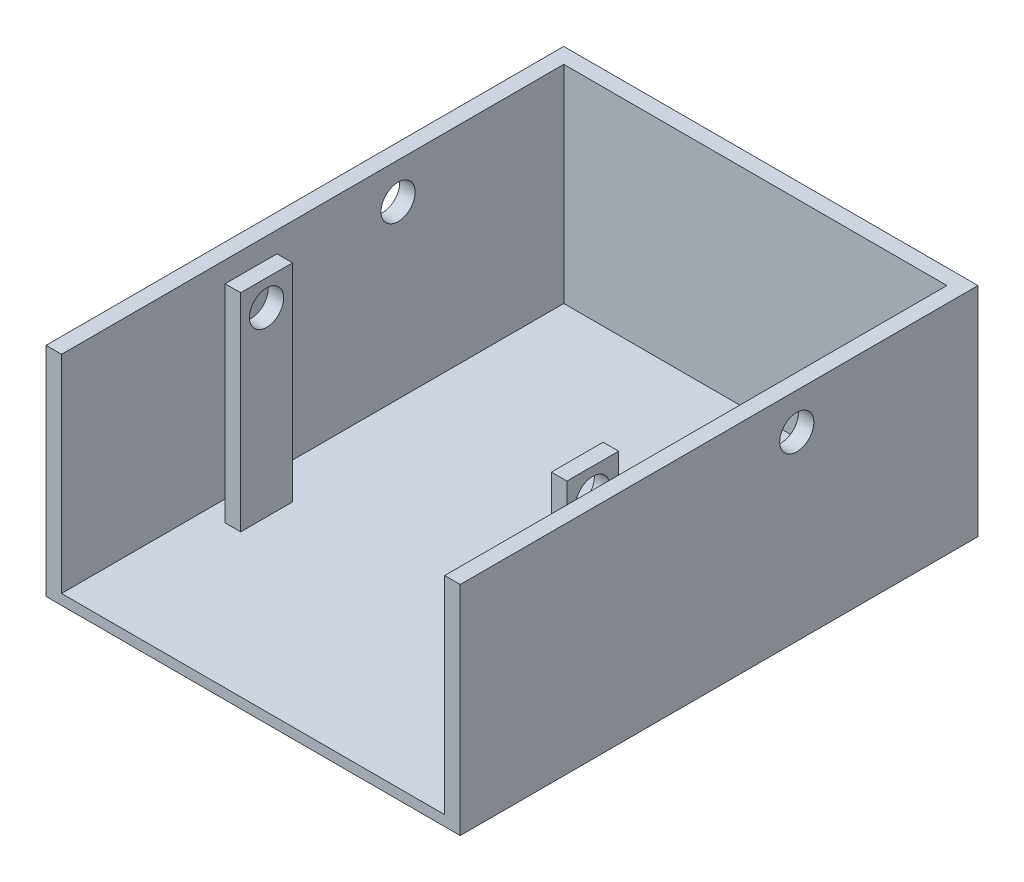
ISO-10303-21;
HEADER;
FILE_DESCRIPTION(('STEP AP214'),'2;1');
FILE_NAME('part.step','',(''),(''),'','','');
FILE_SCHEMA(('AUTOMOTIVE_DESIGN { 1 0 10303 214 1 1 1 1 }'));
ENDSEC;
DATA;
#1=APPLICATION_CONTEXT('core data for automotive mechanical design processes');
#2=APPLICATION_PROTOCOL_DEFINITION('international standard','automotive_design',2000,#1);
#3=PRODUCT_CONTEXT('',#1,'mechanical');
#4=PRODUCT('Part','Part','',(#3));
#5=PRODUCT_RELATED_PRODUCT_CATEGORY('part','',(#4));
#6=PRODUCT_DEFINITION_FORMATION('','',#4);
#7=PRODUCT_DEFINITION_CONTEXT('part definition',#1,'design');
#8=PRODUCT_DEFINITION('design','',#6,#7);
#9=PRODUCT_DEFINITION_SHAPE('','',#8);
#10=(LENGTH_UNIT() NAMED_UNIT(*) SI_UNIT(.MILLI.,.METRE.));
#11=(NAMED_UNIT(*) PLANE_ANGLE_UNIT() SI_UNIT($,.RADIAN.));
#12=(NAMED_UNIT(*) SI_UNIT($,.STERADIAN.) SOLID_ANGLE_UNIT());
#13=UNCERTAINTY_MEASURE_WITH_UNIT(LENGTH_MEASURE(1.E-05),#10,'distance_accuracy_value','');
#14=(GEOMETRIC_REPRESENTATION_CONTEXT(3) GLOBAL_UNCERTAINTY_ASSIGNED_CONTEXT((#13)) GLOBAL_UNIT_ASSIGNED_CONTEXT((#10,
#11,#12)) REPRESENTATION_CONTEXT('',''));
#15=CARTESIAN_POINT('',(0.,0.,0.));
#16=DIRECTION('',(0.,0.,1.));
#17=DIRECTION('',(1.,0.,0.));
#18=AXIS2_PLACEMENT_3D('',#15,#16,#17);
#19=CARTESIAN_POINT('',(0.,10.,0.));
#20=DIRECTION('',(0.,1.,0.));
#21=DIRECTION('',(0.,0.,1.));
#22=AXIS2_PLACEMENT_3D('',#19,#20,#21);
#23=PLANE('',#22);
#24=DIRECTION('',(0.,0.,1.));
#25=VECTOR('',#24,1.);
#26=CARTESIAN_POINT('',(185.,10.,0.));
#27=LINE('',#26,#25);
#28=CARTESIAN_POINT('',(185.,10.,-235.));
#29=VERTEX_POINT('',#28);
#30=CARTESIAN_POINT('',(185.,10.,250.));
#31=VERTEX_POINT('',#30);
#32=EDGE_CURVE('E225',#29,#31,#27,.T.);
#33=ORIENTED_EDGE('',*,*,#32,.F.);
#34=DIRECTION('',(1.,0.,0.));
#35=VECTOR('',#34,1.);
#36=CARTESIAN_POINT('',(0.,10.,-235.));
#37=LINE('',#36,#35);
#38=CARTESIAN_POINT('',(-185.,10.,-235.));
#39=VERTEX_POINT('',#38);
#40=EDGE_CURVE('E230',#39,#29,#37,.T.);
#41=ORIENTED_EDGE('',*,*,#40,.F.);
#42=DIRECTION('',(0.,0.,1.));
#43=VECTOR('',#42,1.);
#44=CARTESIAN_POINT('',(-185.,10.,0.));
#45=LINE('',#44,#43);
#46=CARTESIAN_POINT('',(-185.,10.,250.));
#47=VERTEX_POINT('',#46);
#48=EDGE_CURVE('E251',#39,#47,#45,.T.);
#49=ORIENTED_EDGE('',*,*,#48,.T.);
#50=DIRECTION('',(1.,0.,0.));
#51=VECTOR('',#50,1.);
#52=CARTESIAN_POINT('',(-200.,10.,250.));
#53=LINE('',#52,#51);
#54=EDGE_CURVE('E264',#47,#31,#53,.T.);
#55=ORIENTED_EDGE('',*,*,#54,.T.);
#56=EDGE_LOOP('',(#33,#41,#49,#55));
#57=FACE_BOUND('',#56,.T.);
#58=DIRECTION('',(-1.,0.,0.));
#59=VECTOR('',#58,1.);
#60=CARTESIAN_POINT('',(-165.,10.,62.0000000000001));
#61=LINE('',#60,#59);
#62=CARTESIAN_POINT('',(-150.,10.,61.9999999999999));
#63=VERTEX_POINT('',#62);
#64=CARTESIAN_POINT('',(-165.,10.,62.0000000000001));
#65=VERTEX_POINT('',#64);
#66=EDGE_CURVE('E182',#63,#65,#61,.T.);
#67=ORIENTED_EDGE('',*,*,#66,.F.);
#68=DIRECTION('',(0.,0.,-1.));
#69=VECTOR('',#68,1.);
#70=CARTESIAN_POINT('',(-150.,10.,61.9999999999999));
#71=LINE('',#70,#69);
#72=CARTESIAN_POINT('',(-150.,10.,112.));
#73=VERTEX_POINT('',#72);
#74=EDGE_CURVE('E179',#73,#63,#71,.T.);
#75=ORIENTED_EDGE('',*,*,#74,.F.);
#76=DIRECTION('',(1.,0.,0.));
#77=VECTOR('',#76,1.);
#78=CARTESIAN_POINT('',(-165.,10.,112.));
#79=LINE('',#78,#77);
#80=CARTESIAN_POINT('',(-165.,10.,112.));
#81=VERTEX_POINT('',#80);
#82=EDGE_CURVE('E197',#81,#73,#79,.T.);
#83=ORIENTED_EDGE('',*,*,#82,.F.);
#84=DIRECTION('',(0.,0.,1.));
#85=VECTOR('',#84,1.);
#86=CARTESIAN_POINT('',(-165.,10.,62.0000000000001));
#87=LINE('',#86,#85);
#88=EDGE_CURVE('E205',#65,#81,#87,.T.);
#89=ORIENTED_EDGE('',*,*,#88,.F.);
#90=EDGE_LOOP('',(#67,#75,#83,#89));
#91=FACE_BOUND('',#90,.T.);
#92=DIRECTION('',(-1.,0.,0.));
#93=VECTOR('',#92,1.);
#94=CARTESIAN_POINT('',(150.,10.,61.9999999999999));
#95=LINE('',#94,#93);
#96=CARTESIAN_POINT('',(165.,10.,61.9999999999999));
#97=VERTEX_POINT('',#96);
#98=CARTESIAN_POINT('',(150.,10.,61.9999999999999));
#99=VERTEX_POINT('',#98);
#100=EDGE_CURVE('E178',#97,#99,#95,.T.);
#101=ORIENTED_EDGE('',*,*,#100,.F.);
#102=DIRECTION('',(0.,0.,-1.));
#103=VECTOR('',#102,1.);
#104=CARTESIAN_POINT('',(165.,10.,61.9999999999999));
#105=LINE('',#104,#103);
#106=CARTESIAN_POINT('',(165.,10.,112.));
#107=VERTEX_POINT('',#106);
#108=EDGE_CURVE('E173',#107,#97,#105,.T.);
#109=ORIENTED_EDGE('',*,*,#108,.F.);
#110=DIRECTION('',(1.,0.,0.));
#111=VECTOR('',#110,1.);
#112=CARTESIAN_POINT('',(150.,10.,112.));
#113=LINE('',#112,#111);
#114=CARTESIAN_POINT('',(150.,10.,112.));
#115=VERTEX_POINT('',#114);
#116=EDGE_CURVE('E158',#115,#107,#113,.T.);
#117=ORIENTED_EDGE('',*,*,#116,.F.);
#118=DIRECTION('',(0.,0.,1.));
#119=VECTOR('',#118,1.);
#120=CARTESIAN_POINT('',(150.,10.,61.9999999999999));
#121=LINE('',#120,#119);
#122=EDGE_CURVE('E166',#99,#115,#121,.T.);
#123=ORIENTED_EDGE('',*,*,#122,.F.);
#124=EDGE_LOOP('',(#101,#109,#117,#123));
#125=FACE_BOUND('',#124,.T.);
#126=ADVANCED_FACE('F43',(#57,#91,#125),#23,.T.);
#127=CARTESIAN_POINT('',(200.,10.,-250.));
#128=DIRECTION('',(-1.,0.,0.));
#129=DIRECTION('',(0.,0.,1.));
#130=AXIS2_PLACEMENT_3D('',#127,#128,#129);
#131=PLANE('',#130);
#132=CARTESIAN_POINT('',(200.,175.,-75.));
#133=DIRECTION('',(-1.,0.,0.));
#134=DIRECTION('',(0.,0.,1.));
#135=AXIS2_PLACEMENT_3D('',#132,#133,#134);
#136=CIRCLE('',#135,16.5);
#137=CARTESIAN_POINT('',(200.,175.,-58.5));
#138=VERTEX_POINT('',#137);
#139=EDGE_CURVE('E216',#138,#138,#136,.T.);
#140=ORIENTED_EDGE('',*,*,#139,.T.);
#141=EDGE_LOOP('',(#140));
#142=FACE_BOUND('',#141,.T.);
#143=DIRECTION('',(0.,0.,-1.));
#144=VECTOR('',#143,1.);
#145=CARTESIAN_POINT('',(200.,0.,-250.));
#146=LINE('',#145,#144);
#147=CARTESIAN_POINT('',(200.,0.,250.));
#148=VERTEX_POINT('',#147);
#149=CARTESIAN_POINT('',(200.,0.,-250.));
#150=VERTEX_POINT('',#149);
#151=EDGE_CURVE('E263',#148,#150,#146,.T.);
#152=ORIENTED_EDGE('',*,*,#151,.T.);
#153=DIRECTION('',(0.,-1.,0.));
#154=VECTOR('',#153,1.);
#155=CARTESIAN_POINT('',(200.,10.,-250.));
#156=LINE('',#155,#154);
#157=CARTESIAN_POINT('',(200.,210.,-250.));
#158=VERTEX_POINT('',#157);
#159=EDGE_CURVE('E11',#158,#150,#156,.T.);
#160=ORIENTED_EDGE('',*,*,#159,.F.);
#161=DIRECTION('',(0.,0.,-1.));
#162=VECTOR('',#161,1.);
#163=CARTESIAN_POINT('',(200.,210.,0.));
#164=LINE('',#163,#162);
#165=CARTESIAN_POINT('',(200.,210.,250.));
#166=VERTEX_POINT('',#165);
#167=EDGE_CURVE('E233',#166,#158,#164,.T.);
#168=ORIENTED_EDGE('',*,*,#167,.F.);
#169=DIRECTION('',(0.,-1.,0.));
#170=VECTOR('',#169,1.);
#171=CARTESIAN_POINT('',(200.,10.,250.));
#172=LINE('',#171,#170);
#173=EDGE_CURVE('E267',#166,#148,#172,.T.);
#174=ORIENTED_EDGE('',*,*,#173,.T.);
#175=EDGE_LOOP('',(#152,#160,#168,#174));
#176=FACE_BOUND('',#175,.T.);
#177=ADVANCED_FACE('F45',(#142,#176),#131,.F.);
#178=CARTESIAN_POINT('',(-200.,10.,-250.));
#179=DIRECTION('',(0.,0.,1.));
#180=DIRECTION('',(1.,0.,0.));
#181=AXIS2_PLACEMENT_3D('',#178,#179,#180);
#182=PLANE('',#181);
#183=DIRECTION('',(-1.,0.,0.));
#184=VECTOR('',#183,1.);
#185=CARTESIAN_POINT('',(-200.,0.,-250.));
#186=LINE('',#185,#184);
#187=CARTESIAN_POINT('',(-200.,0.,-250.));
#188=VERTEX_POINT('',#187);
#189=EDGE_CURVE('E271',#150,#188,#186,.T.);
#190=ORIENTED_EDGE('',*,*,#189,.T.);
#191=DIRECTION('',(0.,-1.,0.));
#192=VECTOR('',#191,1.);
#193=CARTESIAN_POINT('',(-200.,10.,-250.));
#194=LINE('',#193,#192);
#195=CARTESIAN_POINT('',(-200.,210.,-250.));
#196=VERTEX_POINT('',#195);
#197=EDGE_CURVE('E52',#196,#188,#194,.T.);
#198=ORIENTED_EDGE('',*,*,#197,.F.);
#199=DIRECTION('',(-1.,0.,0.));
#200=VECTOR('',#199,1.);
#201=CARTESIAN_POINT('',(0.,210.,-250.));
#202=LINE('',#201,#200);
#203=EDGE_CURVE('E237',#158,#196,#202,.T.);
#204=ORIENTED_EDGE('',*,*,#203,.F.);
#205=ORIENTED_EDGE('',*,*,#159,.T.);
#206=EDGE_LOOP('',(#190,#198,#204,#205));
#207=FACE_BOUND('',#206,.T.);
#208=ADVANCED_FACE('F299',(#207),#182,.F.);
#209=CARTESIAN_POINT('',(-200.,10.,-250.));
#210=DIRECTION('',(1.,0.,0.));
#211=DIRECTION('',(0.,0.,-1.));
#212=AXIS2_PLACEMENT_3D('',#209,#210,#211);
#213=PLANE('',#212);
#214=CARTESIAN_POINT('',(-200.,175.,-75.));
#215=DIRECTION('',(1.,0.,0.));
#216=DIRECTION('',(0.,0.,-1.));
#217=AXIS2_PLACEMENT_3D('',#214,#215,#216);
#218=CIRCLE('',#217,16.5);
#219=CARTESIAN_POINT('',(-200.,175.,-91.5));
#220=VERTEX_POINT('',#219);
#221=EDGE_CURVE('E222',#220,#220,#218,.T.);
#222=ORIENTED_EDGE('',*,*,#221,.T.);
#223=EDGE_LOOP('',(#222));
#224=FACE_BOUND('',#223,.T.);
#225=DIRECTION('',(0.,0.,1.));
#226=VECTOR('',#225,1.);
#227=CARTESIAN_POINT('',(-200.,0.,-250.));
#228=LINE('',#227,#226);
#229=CARTESIAN_POINT('',(-200.,0.,250.));
#230=VERTEX_POINT('',#229);
#231=EDGE_CURVE('E273',#188,#230,#228,.T.);
#232=ORIENTED_EDGE('',*,*,#231,.T.);
#233=DIRECTION('',(0.,-1.,0.));
#234=VECTOR('',#233,1.);
#235=CARTESIAN_POINT('',(-200.,10.,250.));
#236=LINE('',#235,#234);
#237=CARTESIAN_POINT('',(-200.,210.,250.));
#238=VERTEX_POINT('',#237);
#239=EDGE_CURVE('E278',#238,#230,#236,.T.);
#240=ORIENTED_EDGE('',*,*,#239,.F.);
#241=DIRECTION('',(0.,0.,1.));
#242=VECTOR('',#241,1.);
#243=CARTESIAN_POINT('',(-200.,210.,0.));
#244=LINE('',#243,#242);
#245=EDGE_CURVE('E240',#196,#238,#244,.T.);
#246=ORIENTED_EDGE('',*,*,#245,.F.);
#247=ORIENTED_EDGE('',*,*,#197,.T.);
#248=EDGE_LOOP('',(#232,#240,#246,#247));
#249=FACE_BOUND('',#248,.T.);
#250=ADVANCED_FACE('F285',(#224,#249),#213,.F.);
#251=CARTESIAN_POINT('',(-200.,10.,250.));
#252=DIRECTION('',(0.,0.,-1.));
#253=DIRECTION('',(-1.,0.,0.));
#254=AXIS2_PLACEMENT_3D('',#251,#252,#253);
#255=PLANE('',#254);
#256=DIRECTION('',(1.,0.,0.));
#257=VECTOR('',#256,1.);
#258=CARTESIAN_POINT('',(-200.,0.,250.));
#259=LINE('',#258,#257);
#260=EDGE_CURVE('E268',#230,#148,#259,.T.);
#261=ORIENTED_EDGE('',*,*,#260,.T.);
#262=ORIENTED_EDGE('',*,*,#173,.F.);
#263=DIRECTION('',(1.,0.,0.));
#264=VECTOR('',#263,1.);
#265=CARTESIAN_POINT('',(0.,210.,250.));
#266=LINE('',#265,#264);
#267=CARTESIAN_POINT('',(185.,210.,250.));
#268=VERTEX_POINT('',#267);
#269=EDGE_CURVE('E229',#268,#166,#266,.T.);
#270=ORIENTED_EDGE('',*,*,#269,.F.);
#271=DIRECTION('',(0.,-1.,0.));
#272=VECTOR('',#271,1.);
#273=CARTESIAN_POINT('',(185.,210.,250.));
#274=LINE('',#273,#272);
#275=EDGE_CURVE('E261',#268,#31,#274,.T.);
#276=ORIENTED_EDGE('',*,*,#275,.T.);
#277=ORIENTED_EDGE('',*,*,#54,.F.);
#278=DIRECTION('',(0.,-1.,0.));
#279=VECTOR('',#278,1.);
#280=CARTESIAN_POINT('',(-185.,210.,250.));
#281=LINE('',#280,#279);
#282=CARTESIAN_POINT('',(-185.,210.,250.));
#283=VERTEX_POINT('',#282);
#284=EDGE_CURVE('E259',#283,#47,#281,.T.);
#285=ORIENTED_EDGE('',*,*,#284,.F.);
#286=EDGE_CURVE('E234',#238,#283,#266,.T.);
#287=ORIENTED_EDGE('',*,*,#286,.F.);
#288=ORIENTED_EDGE('',*,*,#239,.T.);
#289=EDGE_LOOP('',(#261,#262,#270,#276,#277,#285,#287,#288));
#290=FACE_BOUND('',#289,.T.);
#291=ADVANCED_FACE('F293',(#290),#255,.F.);
#292=CARTESIAN_POINT('',(0.,0.,0.));
#293=DIRECTION('',(0.,1.,0.));
#294=DIRECTION('',(0.,0.,1.));
#295=AXIS2_PLACEMENT_3D('',#292,#293,#294);
#296=PLANE('',#295);
#297=ORIENTED_EDGE('',*,*,#151,.F.);
#298=ORIENTED_EDGE('',*,*,#260,.F.);
#299=ORIENTED_EDGE('',*,*,#231,.F.);
#300=ORIENTED_EDGE('',*,*,#189,.F.);
#301=EDGE_LOOP('',(#297,#298,#299,#300));
#302=FACE_BOUND('',#301,.T.);
#303=ADVANCED_FACE('F291',(#302),#296,.F.);
#304=CARTESIAN_POINT('',(185.,210.,0.));
#305=DIRECTION('',(1.,0.,0.));
#306=DIRECTION('',(0.,0.,-1.));
#307=AXIS2_PLACEMENT_3D('',#304,#305,#306);
#308=PLANE('',#307);
#309=CARTESIAN_POINT('',(185.,175.,-75.));
#310=DIRECTION('',(1.,0.,0.));
#311=DIRECTION('',(0.,0.,-1.));
#312=AXIS2_PLACEMENT_3D('',#309,#310,#311);
#313=CIRCLE('',#312,16.5);
#314=CARTESIAN_POINT('',(185.,175.,-91.5));
#315=VERTEX_POINT('',#314);
#316=EDGE_CURVE('E219',#315,#315,#313,.T.);
#317=ORIENTED_EDGE('',*,*,#316,.T.);
#318=EDGE_LOOP('',(#317));
#319=FACE_BOUND('',#318,.T.);
#320=ORIENTED_EDGE('',*,*,#32,.T.);
#321=ORIENTED_EDGE('',*,*,#275,.F.);
#322=DIRECTION('',(0.,0.,1.));
#323=VECTOR('',#322,1.);
#324=CARTESIAN_POINT('',(185.,210.,0.));
#325=LINE('',#324,#323);
#326=CARTESIAN_POINT('',(185.,210.,-235.));
#327=VERTEX_POINT('',#326);
#328=EDGE_CURVE('E226',#327,#268,#325,.T.);
#329=ORIENTED_EDGE('',*,*,#328,.F.);
#330=DIRECTION('',(0.,-1.,0.));
#331=VECTOR('',#330,1.);
#332=CARTESIAN_POINT('',(185.,210.,-235.));
#333=LINE('',#332,#331);
#334=EDGE_CURVE('E248',#327,#29,#333,.T.);
#335=ORIENTED_EDGE('',*,*,#334,.T.);
#336=EDGE_LOOP('',(#320,#321,#329,#335));
#337=FACE_BOUND('',#336,.T.);
#338=ADVANCED_FACE('F317',(#319,#337),#308,.F.);
#339=CARTESIAN_POINT('',(-185.,210.,0.));
#340=DIRECTION('',(1.,0.,0.));
#341=DIRECTION('',(0.,0.,-1.));
#342=AXIS2_PLACEMENT_3D('',#339,#340,#341);
#343=PLANE('',#342);
#344=CARTESIAN_POINT('',(-185.,175.,-75.));
#345=DIRECTION('',(1.,0.,0.));
#346=DIRECTION('',(0.,0.,-1.));
#347=AXIS2_PLACEMENT_3D('',#344,#345,#346);
#348=CIRCLE('',#347,16.5);
#349=CARTESIAN_POINT('',(-185.,175.,-91.5));
#350=VERTEX_POINT('',#349);
#351=EDGE_CURVE('E47',#350,#350,#348,.T.);
#352=ORIENTED_EDGE('',*,*,#351,.F.);
#353=EDGE_LOOP('',(#352));
#354=FACE_BOUND('',#353,.T.);
#355=ORIENTED_EDGE('',*,*,#48,.F.);
#356=DIRECTION('',(0.,-1.,0.));
#357=VECTOR('',#356,1.);
#358=CARTESIAN_POINT('',(-185.,210.,-235.));
#359=LINE('',#358,#357);
#360=CARTESIAN_POINT('',(-185.,210.,-235.));
#361=VERTEX_POINT('',#360);
#362=EDGE_CURVE('E257',#361,#39,#359,.T.);
#363=ORIENTED_EDGE('',*,*,#362,.F.);
#364=DIRECTION('',(0.,0.,1.));
#365=VECTOR('',#364,1.);
#366=CARTESIAN_POINT('',(-185.,210.,0.));
#367=LINE('',#366,#365);
#368=EDGE_CURVE('E243',#361,#283,#367,.T.);
#369=ORIENTED_EDGE('',*,*,#368,.T.);
#370=ORIENTED_EDGE('',*,*,#284,.T.);
#371=EDGE_LOOP('',(#355,#363,#369,#370));
#372=FACE_BOUND('',#371,.T.);
#373=ADVANCED_FACE('F336',(#354,#372),#343,.T.);
#374=CARTESIAN_POINT('',(0.,210.,-235.));
#375=DIRECTION('',(0.,0.,-1.));
#376=DIRECTION('',(-1.,0.,0.));
#377=AXIS2_PLACEMENT_3D('',#374,#375,#376);
#378=PLANE('',#377);
#379=ORIENTED_EDGE('',*,*,#40,.T.);
#380=ORIENTED_EDGE('',*,*,#334,.F.);
#381=DIRECTION('',(1.,0.,0.));
#382=VECTOR('',#381,1.);
#383=CARTESIAN_POINT('',(0.,210.,-235.));
#384=LINE('',#383,#382);
#385=EDGE_CURVE('E246',#361,#327,#384,.T.);
#386=ORIENTED_EDGE('',*,*,#385,.F.);
#387=ORIENTED_EDGE('',*,*,#362,.T.);
#388=EDGE_LOOP('',(#379,#380,#386,#387));
#389=FACE_BOUND('',#388,.T.);
#390=ADVANCED_FACE('F343',(#389),#378,.F.);
#391=CARTESIAN_POINT('',(0.,210.,0.));
#392=DIRECTION('',(0.,1.,0.));
#393=DIRECTION('',(0.,0.,1.));
#394=AXIS2_PLACEMENT_3D('',#391,#392,#393);
#395=PLANE('',#394);
#396=ORIENTED_EDGE('',*,*,#328,.T.);
#397=ORIENTED_EDGE('',*,*,#269,.T.);
#398=ORIENTED_EDGE('',*,*,#167,.T.);
#399=ORIENTED_EDGE('',*,*,#203,.T.);
#400=ORIENTED_EDGE('',*,*,#245,.T.);
#401=ORIENTED_EDGE('',*,*,#286,.T.);
#402=ORIENTED_EDGE('',*,*,#368,.F.);
#403=ORIENTED_EDGE('',*,*,#385,.T.);
#404=EDGE_LOOP('',(#396,#397,#398,#399,#400,#401,#402,#403));
#405=FACE_BOUND('',#404,.T.);
#406=ADVANCED_FACE('F298',(#405),#395,.T.);
#407=CARTESIAN_POINT('',(200.,175.,-75.));
#408=DIRECTION('',(-1.,0.,0.));
#409=DIRECTION('',(0.,0.,1.));
#410=AXIS2_PLACEMENT_3D('',#407,#408,#409);
#411=CYLINDRICAL_SURFACE('',#410,16.5);
#412=ORIENTED_EDGE('',*,*,#351,.T.);
#413=EDGE_LOOP('',(#412));
#414=FACE_BOUND('',#413,.T.);
#415=ORIENTED_EDGE('',*,*,#221,.F.);
#416=EDGE_LOOP('',(#415));
#417=FACE_BOUND('',#416,.T.);
#418=ADVANCED_FACE('F357',(#414,#417),#411,.F.);
#419=ORIENTED_EDGE('',*,*,#139,.F.);
#420=EDGE_LOOP('',(#419));
#421=FACE_BOUND('',#420,.T.);
#422=ORIENTED_EDGE('',*,*,#316,.F.);
#423=EDGE_LOOP('',(#422));
#424=FACE_BOUND('',#423,.T.);
#425=ADVANCED_FACE('F364',(#421,#424),#411,.F.);
#426=CARTESIAN_POINT('',(-150.,210.,61.9999999999999));
#427=DIRECTION('',(-1.,0.,0.));
#428=DIRECTION('',(0.,0.,1.));
#429=AXIS2_PLACEMENT_3D('',#426,#427,#428);
#430=PLANE('',#429);
#431=CARTESIAN_POINT('',(-150.,185.,87.));
#432=DIRECTION('',(1.,0.,0.));
#433=DIRECTION('',(0.,0.,-1.));
#434=AXIS2_PLACEMENT_3D('',#431,#432,#433);
#435=CIRCLE('',#434,16.5);
#436=CARTESIAN_POINT('',(-150.,185.,70.5));
#437=VERTEX_POINT('',#436);
#438=EDGE_CURVE('E670',#437,#437,#435,.T.);
#439=ORIENTED_EDGE('',*,*,#438,.F.);
#440=EDGE_LOOP('',(#439));
#441=FACE_BOUND('',#440,.T.);
#442=ORIENTED_EDGE('',*,*,#74,.T.);
#443=DIRECTION('',(0.,-1.,0.));
#444=VECTOR('',#443,1.);
#445=CARTESIAN_POINT('',(-150.,210.,61.9999999999999));
#446=LINE('',#445,#444);
#447=CARTESIAN_POINT('',(-150.,210.,61.9999999999999));
#448=VERTEX_POINT('',#447);
#449=EDGE_CURVE('E214',#448,#63,#446,.T.);
#450=ORIENTED_EDGE('',*,*,#449,.F.);
#451=DIRECTION('',(0.,0.,-1.));
#452=VECTOR('',#451,1.);
#453=CARTESIAN_POINT('',(-150.,210.,61.9999999999999));
#454=LINE('',#453,#452);
#455=CARTESIAN_POINT('',(-150.,210.,112.));
#456=VERTEX_POINT('',#455);
#457=EDGE_CURVE('E193',#456,#448,#454,.T.);
#458=ORIENTED_EDGE('',*,*,#457,.F.);
#459=DIRECTION('',(0.,-1.,0.));
#460=VECTOR('',#459,1.);
#461=CARTESIAN_POINT('',(-150.,210.,112.));
#462=LINE('',#461,#460);
#463=EDGE_CURVE('E202',#456,#73,#462,.T.);
#464=ORIENTED_EDGE('',*,*,#463,.T.);
#465=EDGE_LOOP('',(#442,#450,#458,#464));
#466=FACE_BOUND('',#465,.T.);
#467=ADVANCED_FACE('F372',(#441,#466),#430,.F.);
#468=CARTESIAN_POINT('',(-165.,210.,62.0000000000001));
#469=DIRECTION('',(0.,0.,1.));
#470=DIRECTION('',(1.,0.,0.));
#471=AXIS2_PLACEMENT_3D('',#468,#469,#470);
#472=PLANE('',#471);
#473=ORIENTED_EDGE('',*,*,#66,.T.);
#474=DIRECTION('',(0.,-1.,0.));
#475=VECTOR('',#474,1.);
#476=CARTESIAN_POINT('',(-165.,210.,62.0000000000001));
#477=LINE('',#476,#475);
#478=CARTESIAN_POINT('',(-165.,210.,62.0000000000001));
#479=VERTEX_POINT('',#478);
#480=EDGE_CURVE('E211',#479,#65,#477,.T.);
#481=ORIENTED_EDGE('',*,*,#480,.F.);
#482=DIRECTION('',(-1.,0.,0.));
#483=VECTOR('',#482,1.);
#484=CARTESIAN_POINT('',(-165.,210.,62.0000000000001));
#485=LINE('',#484,#483);
#486=EDGE_CURVE('E196',#448,#479,#485,.T.);
#487=ORIENTED_EDGE('',*,*,#486,.F.);
#488=ORIENTED_EDGE('',*,*,#449,.T.);
#489=EDGE_LOOP('',(#473,#481,#487,#488));
#490=FACE_BOUND('',#489,.T.);
#491=ADVANCED_FACE('F379',(#490),#472,.F.);
#492=CARTESIAN_POINT('',(-165.,210.,62.0000000000001));
#493=DIRECTION('',(1.,0.,0.));
#494=DIRECTION('',(0.,0.,-1.));
#495=AXIS2_PLACEMENT_3D('',#492,#493,#494);
#496=PLANE('',#495);
#497=CARTESIAN_POINT('',(-165.,185.,87.));
#498=DIRECTION('',(1.,0.,0.));
#499=DIRECTION('',(0.,0.,-1.));
#500=AXIS2_PLACEMENT_3D('',#497,#498,#499);
#501=CIRCLE('',#500,16.5);
#502=CARTESIAN_POINT('',(-165.,185.,70.5));
#503=VERTEX_POINT('',#502);
#504=EDGE_CURVE('E673',#503,#503,#501,.T.);
#505=ORIENTED_EDGE('',*,*,#504,.T.);
#506=EDGE_LOOP('',(#505));
#507=FACE_BOUND('',#506,.T.);
#508=ORIENTED_EDGE('',*,*,#88,.T.);
#509=DIRECTION('',(0.,-1.,0.));
#510=VECTOR('',#509,1.);
#511=CARTESIAN_POINT('',(-165.,210.,112.));
#512=LINE('',#511,#510);
#513=CARTESIAN_POINT('',(-165.,210.,112.));
#514=VERTEX_POINT('',#513);
#515=EDGE_CURVE('E67',#514,#81,#512,.T.);
#516=ORIENTED_EDGE('',*,*,#515,.F.);
#517=DIRECTION('',(0.,0.,1.));
#518=VECTOR('',#517,1.);
#519=CARTESIAN_POINT('',(-165.,210.,62.0000000000001));
#520=LINE('',#519,#518);
#521=EDGE_CURVE('E199',#479,#514,#520,.T.);
#522=ORIENTED_EDGE('',*,*,#521,.F.);
#523=ORIENTED_EDGE('',*,*,#480,.T.);
#524=EDGE_LOOP('',(#508,#516,#522,#523));
#525=FACE_BOUND('',#524,.T.);
#526=ADVANCED_FACE('F387',(#507,#525),#496,.F.);
#527=CARTESIAN_POINT('',(-165.,210.,112.));
#528=DIRECTION('',(0.,0.,-1.));
#529=DIRECTION('',(-1.,0.,0.));
#530=AXIS2_PLACEMENT_3D('',#527,#528,#529);
#531=PLANE('',#530);
#532=ORIENTED_EDGE('',*,*,#82,.T.);
#533=ORIENTED_EDGE('',*,*,#463,.F.);
#534=DIRECTION('',(1.,0.,0.));
#535=VECTOR('',#534,1.);
#536=CARTESIAN_POINT('',(-165.,210.,112.));
#537=LINE('',#536,#535);
#538=EDGE_CURVE('E201',#514,#456,#537,.T.);
#539=ORIENTED_EDGE('',*,*,#538,.F.);
#540=ORIENTED_EDGE('',*,*,#515,.T.);
#541=EDGE_LOOP('',(#532,#533,#539,#540));
#542=FACE_BOUND('',#541,.T.);
#543=ADVANCED_FACE('F395',(#542),#531,.F.);
#544=CARTESIAN_POINT('',(0.,210.,0.));
#545=DIRECTION('',(0.,1.,0.));
#546=DIRECTION('',(0.,0.,1.));
#547=AXIS2_PLACEMENT_3D('',#544,#545,#546);
#548=PLANE('',#547);
#549=ORIENTED_EDGE('',*,*,#457,.T.);
#550=ORIENTED_EDGE('',*,*,#486,.T.);
#551=ORIENTED_EDGE('',*,*,#521,.T.);
#552=ORIENTED_EDGE('',*,*,#538,.T.);
#553=EDGE_LOOP('',(#549,#550,#551,#552));
#554=FACE_BOUND('',#553,.T.);
#555=ADVANCED_FACE('F403',(#554),#548,.T.);
#556=CARTESIAN_POINT('',(165.,210.,61.9999999999999));
#557=DIRECTION('',(-1.,0.,0.));
#558=DIRECTION('',(0.,0.,1.));
#559=AXIS2_PLACEMENT_3D('',#556,#557,#558);
#560=PLANE('',#559);
#561=CARTESIAN_POINT('',(165.,185.,87.));
#562=DIRECTION('',(1.,0.,0.));
#563=DIRECTION('',(0.,0.,-1.));
#564=AXIS2_PLACEMENT_3D('',#561,#562,#563);
#565=CIRCLE('',#564,16.5);
#566=CARTESIAN_POINT('',(165.,185.,70.5));
#567=VERTEX_POINT('',#566);
#568=EDGE_CURVE('E668',#567,#567,#565,.T.);
#569=ORIENTED_EDGE('',*,*,#568,.F.);
#570=EDGE_LOOP('',(#569));
#571=FACE_BOUND('',#570,.T.);
#572=ORIENTED_EDGE('',*,*,#108,.T.);
#573=DIRECTION('',(0.,-1.,0.));
#574=VECTOR('',#573,1.);
#575=CARTESIAN_POINT('',(165.,210.,61.9999999999999));
#576=LINE('',#575,#574);
#577=CARTESIAN_POINT('',(165.,210.,61.9999999999999));
#578=VERTEX_POINT('',#577);
#579=EDGE_CURVE('E676',#578,#97,#576,.T.);
#580=ORIENTED_EDGE('',*,*,#579,.F.);
#581=DIRECTION('',(0.,0.,-1.));
#582=VECTOR('',#581,1.);
#583=CARTESIAN_POINT('',(165.,210.,61.9999999999999));
#584=LINE('',#583,#582);
#585=CARTESIAN_POINT('',(165.,210.,112.));
#586=VERTEX_POINT('',#585);
#587=EDGE_CURVE('E167',#586,#578,#584,.T.);
#588=ORIENTED_EDGE('',*,*,#587,.F.);
#589=DIRECTION('',(0.,-1.,0.));
#590=VECTOR('',#589,1.);
#591=CARTESIAN_POINT('',(165.,210.,112.));
#592=LINE('',#591,#590);
#593=EDGE_CURVE('E161',#586,#107,#592,.T.);
#594=ORIENTED_EDGE('',*,*,#593,.T.);
#595=EDGE_LOOP('',(#572,#580,#588,#594));
#596=FACE_BOUND('',#595,.T.);
#597=ADVANCED_FACE('F171',(#571,#596),#560,.F.);
#598=CARTESIAN_POINT('',(150.,210.,61.9999999999999));
#599=DIRECTION('',(0.,0.,1.));
#600=DIRECTION('',(1.,0.,0.));
#601=AXIS2_PLACEMENT_3D('',#598,#599,#600);
#602=PLANE('',#601);
#603=ORIENTED_EDGE('',*,*,#100,.T.);
#604=DIRECTION('',(0.,-1.,0.));
#605=VECTOR('',#604,1.);
#606=CARTESIAN_POINT('',(150.,210.,61.9999999999999));
#607=LINE('',#606,#605);
#608=CARTESIAN_POINT('',(150.,210.,61.9999999999999));
#609=VERTEX_POINT('',#608);
#610=EDGE_CURVE('E680',#609,#99,#607,.T.);
#611=ORIENTED_EDGE('',*,*,#610,.F.);
#612=DIRECTION('',(-1.,0.,0.));
#613=VECTOR('',#612,1.);
#614=CARTESIAN_POINT('',(150.,210.,61.9999999999999));
#615=LINE('',#614,#613);
#616=EDGE_CURVE('E190',#578,#609,#615,.T.);
#617=ORIENTED_EDGE('',*,*,#616,.F.);
#618=ORIENTED_EDGE('',*,*,#579,.T.);
#619=EDGE_LOOP('',(#603,#611,#617,#618));
#620=FACE_BOUND('',#619,.T.);
#621=ADVANCED_FACE('F417',(#620),#602,.F.);
#622=CARTESIAN_POINT('',(150.,210.,61.9999999999999));
#623=DIRECTION('',(1.,0.,0.));
#624=DIRECTION('',(0.,0.,-1.));
#625=AXIS2_PLACEMENT_3D('',#622,#623,#624);
#626=PLANE('',#625);
#627=CARTESIAN_POINT('',(150.,185.,87.));
#628=DIRECTION('',(1.,0.,0.));
#629=DIRECTION('',(0.,0.,-1.));
#630=AXIS2_PLACEMENT_3D('',#627,#628,#629);
#631=CIRCLE('',#630,16.5);
#632=CARTESIAN_POINT('',(150.,185.,70.5));
#633=VERTEX_POINT('',#632);
#634=EDGE_CURVE('E665',#633,#633,#631,.T.);
#635=ORIENTED_EDGE('',*,*,#634,.T.);
#636=EDGE_LOOP('',(#635));
#637=FACE_BOUND('',#636,.T.);
#638=ORIENTED_EDGE('',*,*,#122,.T.);
#639=DIRECTION('',(0.,-1.,0.));
#640=VECTOR('',#639,1.);
#641=CARTESIAN_POINT('',(150.,210.,112.));
#642=LINE('',#641,#640);
#643=CARTESIAN_POINT('',(150.,210.,112.));
#644=VERTEX_POINT('',#643);
#645=EDGE_CURVE('E59',#644,#115,#642,.T.);
#646=ORIENTED_EDGE('',*,*,#645,.F.);
#647=DIRECTION('',(0.,0.,1.));
#648=VECTOR('',#647,1.);
#649=CARTESIAN_POINT('',(150.,210.,61.9999999999999));
#650=LINE('',#649,#648);
#651=EDGE_CURVE('E188',#609,#644,#650,.T.);
#652=ORIENTED_EDGE('',*,*,#651,.F.);
#653=ORIENTED_EDGE('',*,*,#610,.T.);
#654=EDGE_LOOP('',(#638,#646,#652,#653));
#655=FACE_BOUND('',#654,.T.);
#656=ADVANCED_FACE('F425',(#637,#655),#626,.F.);
#657=CARTESIAN_POINT('',(150.,210.,112.));
#658=DIRECTION('',(0.,0.,-1.));
#659=DIRECTION('',(-1.,0.,0.));
#660=AXIS2_PLACEMENT_3D('',#657,#658,#659);
#661=PLANE('',#660);
#662=ORIENTED_EDGE('',*,*,#116,.T.);
#663=ORIENTED_EDGE('',*,*,#593,.F.);
#664=DIRECTION('',(1.,0.,0.));
#665=VECTOR('',#664,1.);
#666=CARTESIAN_POINT('',(150.,210.,112.));
#667=LINE('',#666,#665);
#668=EDGE_CURVE('E176',#644,#586,#667,.T.);
#669=ORIENTED_EDGE('',*,*,#668,.F.);
#670=ORIENTED_EDGE('',*,*,#645,.T.);
#671=EDGE_LOOP('',(#662,#663,#669,#670));
#672=FACE_BOUND('',#671,.T.);
#673=ADVANCED_FACE('F160',(#672),#661,.F.);
#674=CARTESIAN_POINT('',(0.,210.,0.));
#675=DIRECTION('',(0.,1.,0.));
#676=DIRECTION('',(0.,0.,1.));
#677=AXIS2_PLACEMENT_3D('',#674,#675,#676);
#678=PLANE('',#677);
#679=ORIENTED_EDGE('',*,*,#587,.T.);
#680=ORIENTED_EDGE('',*,*,#616,.T.);
#681=ORIENTED_EDGE('',*,*,#651,.T.);
#682=ORIENTED_EDGE('',*,*,#668,.T.);
#683=EDGE_LOOP('',(#679,#680,#681,#682));
#684=FACE_BOUND('',#683,.T.);
#685=ADVANCED_FACE('F440',(#684),#678,.T.);
#686=CARTESIAN_POINT('',(-165.,185.,87.));
#687=DIRECTION('',(1.,0.,0.));
#688=DIRECTION('',(0.,0.,-1.));
#689=AXIS2_PLACEMENT_3D('',#686,#687,#688);
#690=CYLINDRICAL_SURFACE('',#689,16.5);
#691=ORIENTED_EDGE('',*,*,#504,.F.);
#692=EDGE_LOOP('',(#691));
#693=FACE_BOUND('',#692,.T.);
#694=ORIENTED_EDGE('',*,*,#438,.T.);
#695=EDGE_LOOP('',(#694));
#696=FACE_BOUND('',#695,.T.);
#697=ADVANCED_FACE('F447',(#693,#696),#690,.F.);
#698=CARTESIAN_POINT('',(150.,185.,87.));
#699=DIRECTION('',(1.,0.,0.));
#700=DIRECTION('',(0.,0.,-1.));
#701=AXIS2_PLACEMENT_3D('',#698,#699,#700);
#702=CYLINDRICAL_SURFACE('',#701,16.5);
#703=ORIENTED_EDGE('',*,*,#634,.F.);
#704=EDGE_LOOP('',(#703));
#705=FACE_BOUND('',#704,.T.);
#706=ORIENTED_EDGE('',*,*,#568,.T.);
#707=EDGE_LOOP('',(#706));
#708=FACE_BOUND('',#707,.T.);
#709=ADVANCED_FACE('F455',(#705,#708),#702,.F.);
#710=CLOSED_SHELL('',(#126,#177,#208,#250,#291,#303,#338,#373,#390,#406,#418,#425,#467,#491,
#526,#543,#555,#597,#621,#656,#673,#685,#697,#709));
#711=MANIFOLD_SOLID_BREP('B2',#710);
#712=ADVANCED_BREP_SHAPE_REPRESENTATION('',(#18,#711),#14);
#713=SHAPE_DEFINITION_REPRESENTATION(#9,#712);
ENDSEC;
END-ISO-10303-21;
